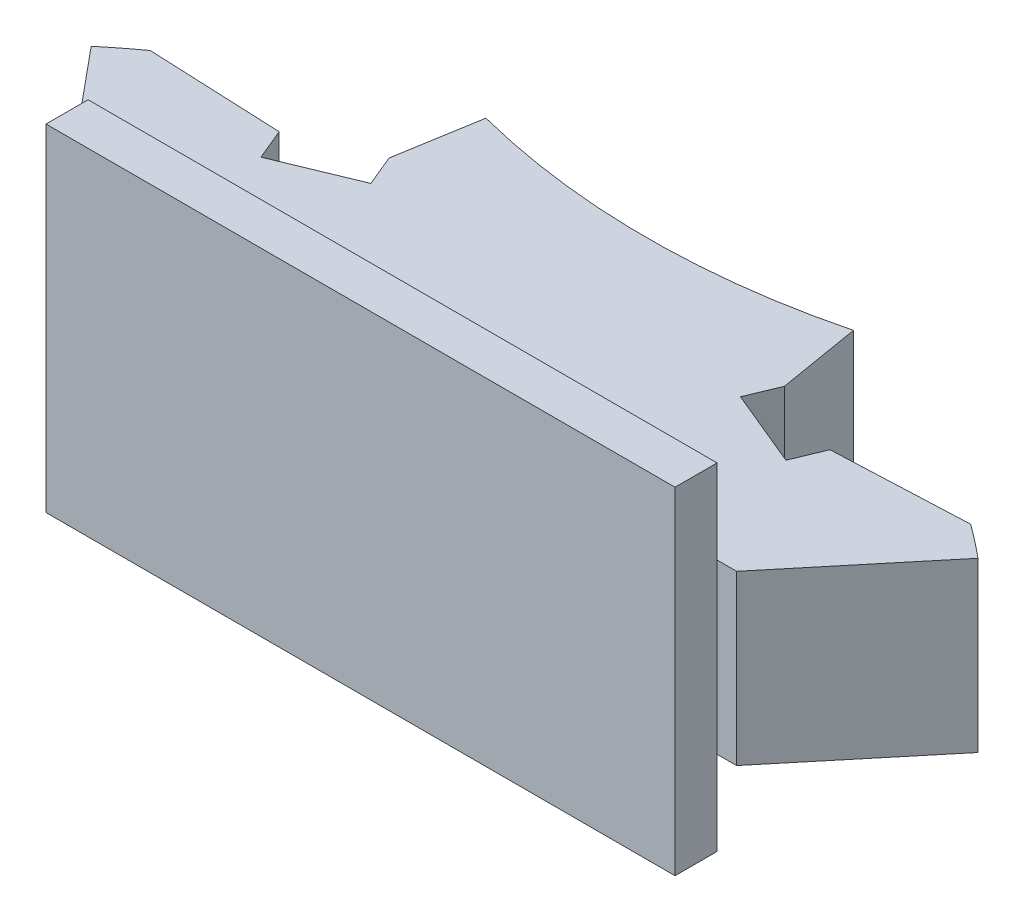
ISO-10303-21;
HEADER;
FILE_DESCRIPTION(('STEP AP214'),'2;1');
FILE_NAME('part.step','',(''),(''),'','','');
FILE_SCHEMA(('AUTOMOTIVE_DESIGN { 1 0 10303 214 1 1 1 1 }'));
ENDSEC;
DATA;
#1=APPLICATION_CONTEXT('core data for automotive mechanical design processes');
#2=APPLICATION_PROTOCOL_DEFINITION('international standard','automotive_design',2000,#1);
#3=PRODUCT_CONTEXT('',#1,'mechanical');
#4=PRODUCT('Part','Part','',(#3));
#5=PRODUCT_RELATED_PRODUCT_CATEGORY('part','',(#4));
#6=PRODUCT_DEFINITION_FORMATION('','',#4);
#7=PRODUCT_DEFINITION_CONTEXT('part definition',#1,'design');
#8=PRODUCT_DEFINITION('design','',#6,#7);
#9=PRODUCT_DEFINITION_SHAPE('','',#8);
#10=(LENGTH_UNIT() NAMED_UNIT(*) SI_UNIT(.MILLI.,.METRE.));
#11=(NAMED_UNIT(*) PLANE_ANGLE_UNIT() SI_UNIT($,.RADIAN.));
#12=(NAMED_UNIT(*) SI_UNIT($,.STERADIAN.) SOLID_ANGLE_UNIT());
#13=UNCERTAINTY_MEASURE_WITH_UNIT(LENGTH_MEASURE(1.E-05),#10,'distance_accuracy_value','');
#14=(GEOMETRIC_REPRESENTATION_CONTEXT(3) GLOBAL_UNCERTAINTY_ASSIGNED_CONTEXT((#13)) GLOBAL_UNIT_ASSIGNED_CONTEXT((#10,
#11,#12)) REPRESENTATION_CONTEXT('',''));
#15=CARTESIAN_POINT('',(0.,0.,0.));
#16=DIRECTION('',(0.,0.,1.));
#17=DIRECTION('',(1.,0.,0.));
#18=AXIS2_PLACEMENT_3D('',#15,#16,#17);
#19=CARTESIAN_POINT('',(-115.533621356237,0.,48.8334296922719));
#20=DIRECTION('',(0.,1.,0.));
#21=DIRECTION('',(0.,0.,1.));
#22=AXIS2_PLACEMENT_3D('',#19,#20,#21);
#23=PLANE('',#22);
#24=DIRECTION('',(1.,0.,0.));
#25=VECTOR('',#24,1.);
#26=CARTESIAN_POINT('',(-115.533621356237,0.,18.415));
#27=LINE('',#26,#25);
#28=CARTESIAN_POINT('',(-25.2117383763098,0.,18.415));
#29=VERTEX_POINT('',#28);
#30=CARTESIAN_POINT('',(-23.7417354028188,0.,18.415));
#31=VERTEX_POINT('',#30);
#32=EDGE_CURVE('E239',#29,#31,#27,.T.);
#33=ORIENTED_EDGE('',*,*,#32,.T.);
#34=DIRECTION('',(1.,0.,0.));
#35=VECTOR('',#34,1.);
#36=CARTESIAN_POINT('',(-115.533621356237,0.,18.415));
#37=LINE('',#36,#35);
#38=CARTESIAN_POINT('',(23.7417354028188,0.,18.415));
#39=VERTEX_POINT('',#38);
#40=EDGE_CURVE('E405',#31,#39,#37,.T.);
#41=ORIENTED_EDGE('',*,*,#40,.T.);
#42=CARTESIAN_POINT('',(25.2117383763098,0.,18.415));
#43=VERTEX_POINT('',#42);
#44=EDGE_CURVE('E230',#39,#43,#27,.T.);
#45=ORIENTED_EDGE('',*,*,#44,.T.);
#46=DIRECTION('',(0.638136368104805,0.,-0.76992335703108));
#47=VECTOR('',#46,1.);
#48=CARTESIAN_POINT('',(-47.0473730286792,0.,105.596957352217));
#49=LINE('',#48,#47);
#50=CARTESIAN_POINT('',(33.4708906434652,0.,8.45017969263472));
#51=VERTEX_POINT('',#50);
#52=EDGE_CURVE('E233',#43,#51,#49,.T.);
#53=ORIENTED_EDGE('',*,*,#52,.T.);
#54=CARTESIAN_POINT('',(0.,0.,48.8334296922719));
#55=DIRECTION('',(0.,1.,0.));
#56=DIRECTION('',(0.,0.,1.));
#57=AXIS2_PLACEMENT_3D('',#54,#55,#56);
#58=CIRCLE('',#57,52.451);
#59=CARTESIAN_POINT('',(30.9661817647511,0.,6.49901121377621));
#60=VERTEX_POINT('',#59);
#61=EDGE_CURVE('E303',#51,#60,#58,.T.);
#62=ORIENTED_EDGE('',*,*,#61,.T.);
#63=DIRECTION('',(0.999048221581858,0.,-0.0436193873653337));
#64=VECTOR('',#63,1.);
#65=CARTESIAN_POINT('',(-117.099727209191,0.,12.9637084121841));
#66=LINE('',#65,#64);
#67=CARTESIAN_POINT('',(20.788013818679,0.,6.94339962338286));
#68=VERTEX_POINT('',#67);
#69=EDGE_CURVE('E300',#68,#60,#66,.T.);
#70=ORIENTED_EDGE('',*,*,#69,.F.);
#71=DIRECTION('',(-0.382683432365092,0.,0.923879532511286));
#72=VECTOR('',#71,1.);
#73=CARTESIAN_POINT('',(-13.9861896043784,0.,90.8957531480484));
#74=LINE('',#73,#72);
#75=CARTESIAN_POINT('',(19.8159979004717,0.,9.29005363596155));
#76=VERTEX_POINT('',#75);
#77=EDGE_CURVE('E296',#68,#76,#74,.T.);
#78=ORIENTED_EDGE('',*,*,#77,.T.);
#79=DIRECTION('',(0.923879532511287,0.,0.382683432365091));
#80=VECTOR('',#79,1.);
#81=CARTESIAN_POINT('',(-81.7314338513875,0.,-32.7722698198149));
#82=LINE('',#81,#80);
#83=CARTESIAN_POINT('',(13.949362869025,0.,6.86001384044323));
#84=VERTEX_POINT('',#83);
#85=EDGE_CURVE('E293',#84,#76,#82,.T.);
#86=ORIENTED_EDGE('',*,*,#85,.F.);
#87=DIRECTION('',(-0.38268343236509,0.,0.923879532511287));
#88=VECTOR('',#87,1.);
#89=CARTESIAN_POINT('',(-19.8528246358249,0.,88.46571335253));
#90=LINE('',#89,#88);
#91=CARTESIAN_POINT('',(14.9213787872323,0.,4.51335982786454));
#92=VERTEX_POINT('',#91);
#93=EDGE_CURVE('E178',#92,#84,#90,.T.);
#94=ORIENTED_EDGE('',*,*,#93,.F.);
#95=DIRECTION('',(-0.165047605860678,0.,-0.986285601537231));
#96=VECTOR('',#95,1.);
#97=CARTESIAN_POINT('',(18.5822933488122,0.,26.3901226061878));
#98=LINE('',#97,#96);
#99=CARTESIAN_POINT('',(13.873326490017,0.,-1.74955374189686));
#100=VERTEX_POINT('',#99);
#101=EDGE_CURVE('E287',#92,#100,#98,.T.);
#102=ORIENTED_EDGE('',*,*,#101,.T.);
#103=CARTESIAN_POINT('',(0.,0.,-55.88));
#104=DIRECTION('',(0.,1.,0.));
#105=DIRECTION('',(0.,0.,1.));
#106=AXIS2_PLACEMENT_3D('',#103,#104,#105);
#107=CIRCLE('',#106,55.88);
#108=CARTESIAN_POINT('',(-13.873326490017,0.,-1.74955374189685));
#109=VERTEX_POINT('',#108);
#110=EDGE_CURVE('E200',#109,#100,#107,.T.);
#111=ORIENTED_EDGE('',*,*,#110,.F.);
#112=DIRECTION('',(0.165047605860678,0.,-0.986285601537231));
#113=VECTOR('',#112,1.);
#114=CARTESIAN_POINT('',(-24.8767296064692,0.,64.00419048889));
#115=LINE('',#114,#113);
#116=CARTESIAN_POINT('',(-14.9213787872323,0.,4.51335982786456));
#117=VERTEX_POINT('',#116);
#118=EDGE_CURVE('E203',#117,#109,#115,.T.);
#119=ORIENTED_EDGE('',*,*,#118,.F.);
#120=DIRECTION('',(0.382683432365091,0.,0.923879532511286));
#121=VECTOR('',#120,1.);
#122=CARTESIAN_POINT('',(-13.9861896043782,0.,6.77110623649548));
#123=LINE('',#122,#121);
#124=CARTESIAN_POINT('',(-13.949362869025,0.,6.86001384044322));
#125=VERTEX_POINT('',#124);
#126=EDGE_CURVE('E207',#117,#125,#123,.T.);
#127=ORIENTED_EDGE('',*,*,#126,.T.);
#128=DIRECTION('',(0.923879532511287,0.,-0.38268343236509));
#129=VECTOR('',#128,1.);
#130=CARTESIAN_POINT('',(-115.496794620884,0.,48.9223372962196));
#131=LINE('',#130,#129);
#132=CARTESIAN_POINT('',(-19.8159979004716,0.,9.29005363596155));
#133=VERTEX_POINT('',#132);
#134=EDGE_CURVE('E211',#133,#125,#131,.T.);
#135=ORIENTED_EDGE('',*,*,#134,.F.);
#136=DIRECTION('',(0.382683432365089,0.,0.923879532511287));
#137=VECTOR('',#136,1.);
#138=CARTESIAN_POINT('',(-19.8528246358248,0.,9.201146032014));
#139=LINE('',#138,#137);
#140=CARTESIAN_POINT('',(-20.788013818679,0.,6.94339962338288));
#141=VERTEX_POINT('',#140);
#142=EDGE_CURVE('E215',#141,#133,#139,.T.);
#143=ORIENTED_EDGE('',*,*,#142,.F.);
#144=DIRECTION('',(-0.999048221581858,0.,-0.0436193873653335));
#145=VECTOR('',#144,1.);
#146=CARTESIAN_POINT('',(-113.527875193469,0.,2.8942898305551));
#147=LINE('',#146,#145);
#148=CARTESIAN_POINT('',(-30.9661817647511,0.,6.49901121377622));
#149=VERTEX_POINT('',#148);
#150=EDGE_CURVE('E218',#141,#149,#147,.T.);
#151=ORIENTED_EDGE('',*,*,#150,.T.);
#152=CARTESIAN_POINT('',(0.,0.,48.8334296922719));
#153=DIRECTION('',(0.,1.,0.));
#154=DIRECTION('',(0.,0.,1.));
#155=AXIS2_PLACEMENT_3D('',#152,#153,#154);
#156=CIRCLE('',#155,52.451);
#157=CARTESIAN_POINT('',(-33.4708906434651,0.,8.4501796926347));
#158=VERTEX_POINT('',#157);
#159=EDGE_CURVE('E222',#149,#158,#156,.T.);
#160=ORIENTED_EDGE('',*,*,#159,.T.);
#161=DIRECTION('',(-0.638136368104805,0.,-0.76992335703108));
#162=VECTOR('',#161,1.);
#163=CARTESIAN_POINT('',(-47.0473730286792,0.,-7.93009796767349));
#164=LINE('',#163,#162);
#165=EDGE_CURVE('E226',#29,#158,#164,.T.);
#166=ORIENTED_EDGE('',*,*,#165,.F.);
#167=EDGE_LOOP('',(#33,#41,#45,#53,#62,#70,#78,#86,#94,#102,#111,#119,#127,#135,#143,#151,#160,#166));
#168=FACE_BOUND('',#167,.T.);
#169=ADVANCED_FACE('F39',(#168),#23,.T.);
#170=CARTESIAN_POINT('',(-115.533621356237,-12.7,18.415));
#171=DIRECTION('',(0.,0.,1.));
#172=DIRECTION('',(1.,0.,0.));
#173=AXIS2_PLACEMENT_3D('',#170,#171,#172);
#174=PLANE('',#173);
#175=DIRECTION('',(1.,0.,0.));
#176=VECTOR('',#175,1.);
#177=CARTESIAN_POINT('',(-115.533621356237,-12.7,18.415));
#178=LINE('',#177,#176);
#179=CARTESIAN_POINT('',(-25.2117383763098,-12.7,18.415));
#180=VERTEX_POINT('',#179);
#181=CARTESIAN_POINT('',(-23.7417354028188,-12.7,18.415));
#182=VERTEX_POINT('',#181);
#183=EDGE_CURVE('E443',#180,#182,#178,.T.);
#184=ORIENTED_EDGE('',*,*,#183,.T.);
#185=DIRECTION('',(0.,1.,0.));
#186=VECTOR('',#185,1.);
#187=CARTESIAN_POINT('',(-23.7417354028188,-19.05,18.415));
#188=LINE('',#187,#186);
#189=EDGE_CURVE('E50',#182,#31,#188,.T.);
#190=ORIENTED_EDGE('',*,*,#189,.T.);
#191=ORIENTED_EDGE('',*,*,#32,.F.);
#192=DIRECTION('',(0.,1.,0.));
#193=VECTOR('',#192,1.);
#194=CARTESIAN_POINT('',(-25.2117383763098,-12.7,18.415));
#195=LINE('',#194,#193);
#196=EDGE_CURVE('E265',#180,#29,#195,.T.);
#197=ORIENTED_EDGE('',*,*,#196,.F.);
#198=EDGE_LOOP('',(#184,#190,#191,#197));
#199=FACE_BOUND('',#198,.T.);
#200=ADVANCED_FACE('F343',(#199),#174,.T.);
#201=CARTESIAN_POINT('',(0.,-12.7,-55.88));
#202=DIRECTION('',(0.,1.,0.));
#203=DIRECTION('',(0.,0.,1.));
#204=AXIS2_PLACEMENT_3D('',#201,#202,#203);
#205=CYLINDRICAL_SURFACE('',#204,55.88);
#206=ORIENTED_EDGE('',*,*,#110,.T.);
#207=DIRECTION('',(0.,1.,0.));
#208=VECTOR('',#207,1.);
#209=CARTESIAN_POINT('',(13.873326490017,-12.7,-1.74955374189686));
#210=LINE('',#209,#208);
#211=CARTESIAN_POINT('',(13.873326490017,-12.7,-1.74955374189686));
#212=VERTEX_POINT('',#211);
#213=EDGE_CURVE('E119',#212,#100,#210,.T.);
#214=ORIENTED_EDGE('',*,*,#213,.F.);
#215=CARTESIAN_POINT('',(0.,-12.7,-55.88));
#216=DIRECTION('',(0.,1.,0.));
#217=DIRECTION('',(0.,0.,1.));
#218=AXIS2_PLACEMENT_3D('',#215,#216,#217);
#219=CIRCLE('',#218,55.88);
#220=CARTESIAN_POINT('',(-13.873326490017,-12.7,-1.74955374189685));
#221=VERTEX_POINT('',#220);
#222=EDGE_CURVE('E59',#221,#212,#219,.T.);
#223=ORIENTED_EDGE('',*,*,#222,.F.);
#224=DIRECTION('',(0.,1.,0.));
#225=VECTOR('',#224,1.);
#226=CARTESIAN_POINT('',(-13.873326490017,-12.7,-1.74955374189685));
#227=LINE('',#226,#225);
#228=EDGE_CURVE('E199',#221,#109,#227,.T.);
#229=ORIENTED_EDGE('',*,*,#228,.T.);
#230=EDGE_LOOP('',(#206,#214,#223,#229));
#231=FACE_BOUND('',#230,.T.);
#232=ADVANCED_FACE('F41',(#231),#205,.F.);
#233=CARTESIAN_POINT('',(18.5822933488122,-12.7,26.3901226061878));
#234=DIRECTION('',(0.986285601537231,0.,-0.165047605860678));
#235=DIRECTION('',(-0.165047605860678,0.,-0.986285601537231));
#236=AXIS2_PLACEMENT_3D('',#233,#234,#235);
#237=PLANE('',#236);
#238=ORIENTED_EDGE('',*,*,#101,.F.);
#239=DIRECTION('',(0.,1.,0.));
#240=VECTOR('',#239,1.);
#241=CARTESIAN_POINT('',(14.9213787872323,-12.7,4.51335982786454));
#242=LINE('',#241,#240);
#243=CARTESIAN_POINT('',(14.9213787872323,-12.7,4.51335982786454));
#244=VERTEX_POINT('',#243);
#245=EDGE_CURVE('E112',#244,#92,#242,.T.);
#246=ORIENTED_EDGE('',*,*,#245,.F.);
#247=DIRECTION('',(-0.165047605860678,0.,-0.986285601537231));
#248=VECTOR('',#247,1.);
#249=CARTESIAN_POINT('',(18.5822933488122,-12.7,26.3901226061878));
#250=LINE('',#249,#248);
#251=EDGE_CURVE('E172',#244,#212,#250,.T.);
#252=ORIENTED_EDGE('',*,*,#251,.T.);
#253=ORIENTED_EDGE('',*,*,#213,.T.);
#254=EDGE_LOOP('',(#238,#246,#252,#253));
#255=FACE_BOUND('',#254,.T.);
#256=ADVANCED_FACE('F335',(#255),#237,.T.);
#257=CARTESIAN_POINT('',(-19.8528246358249,-12.7,88.46571335253));
#258=DIRECTION('',(-0.923879532511287,0.,-0.38268343236509));
#259=DIRECTION('',(-0.38268343236509,0.,0.923879532511287));
#260=AXIS2_PLACEMENT_3D('',#257,#258,#259);
#261=PLANE('',#260);
#262=ORIENTED_EDGE('',*,*,#93,.T.);
#263=DIRECTION('',(0.,1.,0.));
#264=VECTOR('',#263,1.);
#265=CARTESIAN_POINT('',(13.949362869025,-12.7,6.86001384044323));
#266=LINE('',#265,#264);
#267=CARTESIAN_POINT('',(13.949362869025,-12.7,6.86001384044323));
#268=VERTEX_POINT('',#267);
#269=EDGE_CURVE('E176',#268,#84,#266,.T.);
#270=ORIENTED_EDGE('',*,*,#269,.F.);
#271=DIRECTION('',(-0.38268343236509,0.,0.923879532511287));
#272=VECTOR('',#271,1.);
#273=CARTESIAN_POINT('',(-19.8528246358249,-12.7,88.46571335253));
#274=LINE('',#273,#272);
#275=EDGE_CURVE('E165',#244,#268,#274,.T.);
#276=ORIENTED_EDGE('',*,*,#275,.F.);
#277=ORIENTED_EDGE('',*,*,#245,.T.);
#278=EDGE_LOOP('',(#262,#270,#276,#277));
#279=FACE_BOUND('',#278,.T.);
#280=ADVANCED_FACE('F177',(#279),#261,.F.);
#281=CARTESIAN_POINT('',(-81.7314338513875,-12.7,-32.7722698198149));
#282=DIRECTION('',(-0.382683432365091,0.,0.923879532511286));
#283=DIRECTION('',(0.923879532511287,0.,0.382683432365091));
#284=AXIS2_PLACEMENT_3D('',#281,#282,#283);
#285=PLANE('',#284);
#286=ORIENTED_EDGE('',*,*,#85,.T.);
#287=DIRECTION('',(0.,1.,0.));
#288=VECTOR('',#287,1.);
#289=CARTESIAN_POINT('',(19.8159979004717,-12.7,9.29005363596155));
#290=LINE('',#289,#288);
#291=CARTESIAN_POINT('',(19.8159979004717,-12.7,9.29005363596155));
#292=VERTEX_POINT('',#291);
#293=EDGE_CURVE('E183',#292,#76,#290,.T.);
#294=ORIENTED_EDGE('',*,*,#293,.F.);
#295=DIRECTION('',(0.923879532511287,0.,0.382683432365091));
#296=VECTOR('',#295,1.);
#297=CARTESIAN_POINT('',(-81.7314338513875,-12.7,-32.7722698198149));
#298=LINE('',#297,#296);
#299=EDGE_CURVE('E170',#268,#292,#298,.T.);
#300=ORIENTED_EDGE('',*,*,#299,.F.);
#301=ORIENTED_EDGE('',*,*,#269,.T.);
#302=EDGE_LOOP('',(#286,#294,#300,#301));
#303=FACE_BOUND('',#302,.T.);
#304=ADVANCED_FACE('F185',(#303),#285,.F.);
#305=CARTESIAN_POINT('',(-13.9861896043784,-12.7,90.8957531480484));
#306=DIRECTION('',(-0.923879532511286,0.,-0.382683432365092));
#307=DIRECTION('',(-0.382683432365092,0.,0.923879532511286));
#308=AXIS2_PLACEMENT_3D('',#305,#306,#307);
#309=PLANE('',#308);
#310=ORIENTED_EDGE('',*,*,#77,.F.);
#311=DIRECTION('',(0.,1.,0.));
#312=VECTOR('',#311,1.);
#313=CARTESIAN_POINT('',(20.788013818679,-12.7,6.94339962338286));
#314=LINE('',#313,#312);
#315=CARTESIAN_POINT('',(20.788013818679,-12.7,6.94339962338286));
#316=VERTEX_POINT('',#315);
#317=EDGE_CURVE('E278',#316,#68,#314,.T.);
#318=ORIENTED_EDGE('',*,*,#317,.F.);
#319=DIRECTION('',(-0.382683432365092,0.,0.923879532511286));
#320=VECTOR('',#319,1.);
#321=CARTESIAN_POINT('',(-13.9861896043784,-12.7,90.8957531480484));
#322=LINE('',#321,#320);
#323=EDGE_CURVE('E188',#316,#292,#322,.T.);
#324=ORIENTED_EDGE('',*,*,#323,.T.);
#325=ORIENTED_EDGE('',*,*,#293,.T.);
#326=EDGE_LOOP('',(#310,#318,#324,#325));
#327=FACE_BOUND('',#326,.T.);
#328=ADVANCED_FACE('F333',(#327),#309,.T.);
#329=CARTESIAN_POINT('',(-117.099727209191,-12.7,12.9637084121841));
#330=DIRECTION('',(0.0436193873653337,0.,0.999048221581858));
#331=DIRECTION('',(0.999048221581858,0.,-0.0436193873653337));
#332=AXIS2_PLACEMENT_3D('',#329,#330,#331);
#333=PLANE('',#332);
#334=ORIENTED_EDGE('',*,*,#69,.T.);
#335=DIRECTION('',(0.,1.,0.));
#336=VECTOR('',#335,1.);
#337=CARTESIAN_POINT('',(30.9661817647511,-12.7,6.49901121377621));
#338=LINE('',#337,#336);
#339=CARTESIAN_POINT('',(30.9661817647511,-12.7,6.49901121377621));
#340=VERTEX_POINT('',#339);
#341=EDGE_CURVE('E275',#340,#60,#338,.T.);
#342=ORIENTED_EDGE('',*,*,#341,.F.);
#343=DIRECTION('',(0.999048221581858,0.,-0.0436193873653337));
#344=VECTOR('',#343,1.);
#345=CARTESIAN_POINT('',(-117.099727209191,-12.7,12.9637084121841));
#346=LINE('',#345,#344);
#347=EDGE_CURVE('E193',#316,#340,#346,.T.);
#348=ORIENTED_EDGE('',*,*,#347,.F.);
#349=ORIENTED_EDGE('',*,*,#317,.T.);
#350=EDGE_LOOP('',(#334,#342,#348,#349));
#351=FACE_BOUND('',#350,.T.);
#352=ADVANCED_FACE('F330',(#351),#333,.F.);
#353=CARTESIAN_POINT('',(0.,-12.7,48.8334296922719));
#354=DIRECTION('',(0.,1.,0.));
#355=DIRECTION('',(0.,0.,1.));
#356=AXIS2_PLACEMENT_3D('',#353,#354,#355);
#357=CYLINDRICAL_SURFACE('',#356,52.451);
#358=ORIENTED_EDGE('',*,*,#61,.F.);
#359=DIRECTION('',(0.,1.,0.));
#360=VECTOR('',#359,1.);
#361=CARTESIAN_POINT('',(33.4708906434652,-12.7,8.45017969263472));
#362=LINE('',#361,#360);
#363=CARTESIAN_POINT('',(33.4708906434652,-12.7,8.45017969263472));
#364=VERTEX_POINT('',#363);
#365=EDGE_CURVE('E272',#364,#51,#362,.T.);
#366=ORIENTED_EDGE('',*,*,#365,.F.);
#367=CARTESIAN_POINT('',(0.,-12.7,48.8334296922719));
#368=DIRECTION('',(0.,1.,0.));
#369=DIRECTION('',(0.,0.,1.));
#370=AXIS2_PLACEMENT_3D('',#367,#368,#369);
#371=CIRCLE('',#370,52.451);
#372=EDGE_CURVE('E327',#364,#340,#371,.T.);
#373=ORIENTED_EDGE('',*,*,#372,.T.);
#374=ORIENTED_EDGE('',*,*,#341,.T.);
#375=EDGE_LOOP('',(#358,#366,#373,#374));
#376=FACE_BOUND('',#375,.T.);
#377=ADVANCED_FACE('F325',(#376),#357,.T.);
#378=CARTESIAN_POINT('',(-47.0473730286792,-12.7,105.596957352217));
#379=DIRECTION('',(0.76992335703108,0.,0.638136368104805));
#380=DIRECTION('',(0.638136368104805,0.,-0.76992335703108));
#381=AXIS2_PLACEMENT_3D('',#378,#379,#380);
#382=PLANE('',#381);
#383=ORIENTED_EDGE('',*,*,#52,.F.);
#384=DIRECTION('',(0.,1.,0.));
#385=VECTOR('',#384,1.);
#386=CARTESIAN_POINT('',(25.2117383763098,-12.7,18.415));
#387=LINE('',#386,#385);
#388=CARTESIAN_POINT('',(25.2117383763098,-12.7,18.415));
#389=VERTEX_POINT('',#388);
#390=EDGE_CURVE('E268',#389,#43,#387,.T.);
#391=ORIENTED_EDGE('',*,*,#390,.F.);
#392=DIRECTION('',(0.638136368104805,0.,-0.76992335703108));
#393=VECTOR('',#392,1.);
#394=CARTESIAN_POINT('',(-47.0473730286792,-12.7,105.596957352217));
#395=LINE('',#394,#393);
#396=EDGE_CURVE('E321',#389,#364,#395,.T.);
#397=ORIENTED_EDGE('',*,*,#396,.T.);
#398=ORIENTED_EDGE('',*,*,#365,.T.);
#399=EDGE_LOOP('',(#383,#391,#397,#398));
#400=FACE_BOUND('',#399,.T.);
#401=ADVANCED_FACE('F318',(#400),#382,.T.);
#402=DIRECTION('',(0.,1.,0.));
#403=VECTOR('',#402,1.);
#404=CARTESIAN_POINT('',(23.7417354028188,-19.05,18.415));
#405=LINE('',#404,#403);
#406=CARTESIAN_POINT('',(23.7417354028188,-12.7,18.415));
#407=VERTEX_POINT('',#406);
#408=EDGE_CURVE('E11',#407,#39,#405,.T.);
#409=ORIENTED_EDGE('',*,*,#408,.F.);
#410=EDGE_CURVE('E455',#407,#389,#178,.T.);
#411=ORIENTED_EDGE('',*,*,#410,.T.);
#412=ORIENTED_EDGE('',*,*,#390,.T.);
#413=ORIENTED_EDGE('',*,*,#44,.F.);
#414=EDGE_LOOP('',(#409,#411,#412,#413));
#415=FACE_BOUND('',#414,.T.);
#416=ADVANCED_FACE('F352',(#415),#174,.T.);
#417=CARTESIAN_POINT('',(-47.0473730286792,-12.7,-7.93009796767349));
#418=DIRECTION('',(0.76992335703108,0.,-0.638136368104805));
#419=DIRECTION('',(-0.638136368104805,0.,-0.76992335703108));
#420=AXIS2_PLACEMENT_3D('',#417,#418,#419);
#421=PLANE('',#420);
#422=ORIENTED_EDGE('',*,*,#165,.T.);
#423=DIRECTION('',(0.,1.,0.));
#424=VECTOR('',#423,1.);
#425=CARTESIAN_POINT('',(-33.4708906434651,-12.7,8.4501796926347));
#426=LINE('',#425,#424);
#427=CARTESIAN_POINT('',(-33.4708906434651,-12.7,8.4501796926347));
#428=VERTEX_POINT('',#427);
#429=EDGE_CURVE('E262',#428,#158,#426,.T.);
#430=ORIENTED_EDGE('',*,*,#429,.F.);
#431=DIRECTION('',(-0.638136368104805,0.,-0.76992335703108));
#432=VECTOR('',#431,1.);
#433=CARTESIAN_POINT('',(-47.0473730286792,-12.7,-7.93009796767349));
#434=LINE('',#433,#432);
#435=EDGE_CURVE('E452',#180,#428,#434,.T.);
#436=ORIENTED_EDGE('',*,*,#435,.F.);
#437=ORIENTED_EDGE('',*,*,#196,.T.);
#438=EDGE_LOOP('',(#422,#430,#436,#437));
#439=FACE_BOUND('',#438,.T.);
#440=ADVANCED_FACE('F449',(#439),#421,.F.);
#441=CARTESIAN_POINT('',(0.,-12.7,48.8334296922719));
#442=DIRECTION('',(0.,1.,0.));
#443=DIRECTION('',(0.,0.,1.));
#444=AXIS2_PLACEMENT_3D('',#441,#442,#443);
#445=CYLINDRICAL_SURFACE('',#444,52.451);
#446=ORIENTED_EDGE('',*,*,#159,.F.);
#447=DIRECTION('',(0.,1.,0.));
#448=VECTOR('',#447,1.);
#449=CARTESIAN_POINT('',(-30.9661817647511,-12.7,6.49901121377622));
#450=LINE('',#449,#448);
#451=CARTESIAN_POINT('',(-30.9661817647511,-12.7,6.49901121377622));
#452=VERTEX_POINT('',#451);
#453=EDGE_CURVE('E259',#452,#149,#450,.T.);
#454=ORIENTED_EDGE('',*,*,#453,.F.);
#455=CARTESIAN_POINT('',(0.,-12.7,48.8334296922719));
#456=DIRECTION('',(0.,1.,0.));
#457=DIRECTION('',(0.,0.,1.));
#458=AXIS2_PLACEMENT_3D('',#455,#456,#457);
#459=CIRCLE('',#458,52.451);
#460=EDGE_CURVE('E456',#452,#428,#459,.T.);
#461=ORIENTED_EDGE('',*,*,#460,.T.);
#462=ORIENTED_EDGE('',*,*,#429,.T.);
#463=EDGE_LOOP('',(#446,#454,#461,#462));
#464=FACE_BOUND('',#463,.T.);
#465=ADVANCED_FACE('F522',(#464),#445,.T.);
#466=CARTESIAN_POINT('',(-113.527875193469,-12.7,2.8942898305551));
#467=DIRECTION('',(0.0436193873653335,0.,-0.999048221581858));
#468=DIRECTION('',(-0.999048221581858,0.,-0.0436193873653335));
#469=AXIS2_PLACEMENT_3D('',#466,#467,#468);
#470=PLANE('',#469);
#471=ORIENTED_EDGE('',*,*,#150,.F.);
#472=DIRECTION('',(0.,1.,0.));
#473=VECTOR('',#472,1.);
#474=CARTESIAN_POINT('',(-20.788013818679,-12.7,6.94339962338288));
#475=LINE('',#474,#473);
#476=CARTESIAN_POINT('',(-20.788013818679,-12.7,6.94339962338288));
#477=VERTEX_POINT('',#476);
#478=EDGE_CURVE('E256',#477,#141,#475,.T.);
#479=ORIENTED_EDGE('',*,*,#478,.F.);
#480=DIRECTION('',(-0.999048221581858,0.,-0.0436193873653335));
#481=VECTOR('',#480,1.);
#482=CARTESIAN_POINT('',(-113.527875193469,-12.7,2.8942898305551));
#483=LINE('',#482,#481);
#484=EDGE_CURVE('E516',#477,#452,#483,.T.);
#485=ORIENTED_EDGE('',*,*,#484,.T.);
#486=ORIENTED_EDGE('',*,*,#453,.T.);
#487=EDGE_LOOP('',(#471,#479,#485,#486));
#488=FACE_BOUND('',#487,.T.);
#489=ADVANCED_FACE('F526',(#488),#470,.T.);
#490=CARTESIAN_POINT('',(-19.8528246358248,-12.7,9.201146032014));
#491=DIRECTION('',(-0.923879532511287,0.,0.382683432365089));
#492=DIRECTION('',(0.382683432365089,0.,0.923879532511287));
#493=AXIS2_PLACEMENT_3D('',#490,#491,#492);
#494=PLANE('',#493);
#495=ORIENTED_EDGE('',*,*,#142,.T.);
#496=DIRECTION('',(0.,1.,0.));
#497=VECTOR('',#496,1.);
#498=CARTESIAN_POINT('',(-19.8159979004716,-12.7,9.29005363596155));
#499=LINE('',#498,#497);
#500=CARTESIAN_POINT('',(-19.8159979004716,-12.7,9.29005363596155));
#501=VERTEX_POINT('',#500);
#502=EDGE_CURVE('E252',#501,#133,#499,.T.);
#503=ORIENTED_EDGE('',*,*,#502,.F.);
#504=DIRECTION('',(0.382683432365089,0.,0.923879532511287));
#505=VECTOR('',#504,1.);
#506=CARTESIAN_POINT('',(-19.8528246358248,-12.7,9.201146032014));
#507=LINE('',#506,#505);
#508=EDGE_CURVE('E514',#477,#501,#507,.T.);
#509=ORIENTED_EDGE('',*,*,#508,.F.);
#510=ORIENTED_EDGE('',*,*,#478,.T.);
#511=EDGE_LOOP('',(#495,#503,#509,#510));
#512=FACE_BOUND('',#511,.T.);
#513=ADVANCED_FACE('F531',(#512),#494,.F.);
#514=CARTESIAN_POINT('',(-115.496794620884,-12.7,48.9223372962196));
#515=DIRECTION('',(0.38268343236509,0.,0.923879532511287));
#516=DIRECTION('',(0.923879532511287,0.,-0.38268343236509));
#517=AXIS2_PLACEMENT_3D('',#514,#515,#516);
#518=PLANE('',#517);
#519=ORIENTED_EDGE('',*,*,#134,.T.);
#520=DIRECTION('',(0.,1.,0.));
#521=VECTOR('',#520,1.);
#522=CARTESIAN_POINT('',(-13.949362869025,-12.7,6.86001384044322));
#523=LINE('',#522,#521);
#524=CARTESIAN_POINT('',(-13.949362869025,-12.7,6.86001384044322));
#525=VERTEX_POINT('',#524);
#526=EDGE_CURVE('E249',#525,#125,#523,.T.);
#527=ORIENTED_EDGE('',*,*,#526,.F.);
#528=DIRECTION('',(0.923879532511287,0.,-0.38268343236509));
#529=VECTOR('',#528,1.);
#530=CARTESIAN_POINT('',(-115.496794620884,-12.7,48.9223372962196));
#531=LINE('',#530,#529);
#532=EDGE_CURVE('E511',#501,#525,#531,.T.);
#533=ORIENTED_EDGE('',*,*,#532,.F.);
#534=ORIENTED_EDGE('',*,*,#502,.T.);
#535=EDGE_LOOP('',(#519,#527,#533,#534));
#536=FACE_BOUND('',#535,.T.);
#537=ADVANCED_FACE('F535',(#536),#518,.F.);
#538=CARTESIAN_POINT('',(-13.9861896043782,-12.7,6.77110623649548));
#539=DIRECTION('',(-0.923879532511286,0.,0.382683432365091));
#540=DIRECTION('',(0.382683432365091,0.,0.923879532511286));
#541=AXIS2_PLACEMENT_3D('',#538,#539,#540);
#542=PLANE('',#541);
#543=ORIENTED_EDGE('',*,*,#126,.F.);
#544=DIRECTION('',(0.,1.,0.));
#545=VECTOR('',#544,1.);
#546=CARTESIAN_POINT('',(-14.9213787872323,-12.7,4.51335982786456));
#547=LINE('',#546,#545);
#548=CARTESIAN_POINT('',(-14.9213787872323,-12.7,4.51335982786456));
#549=VERTEX_POINT('',#548);
#550=EDGE_CURVE('E246',#549,#117,#547,.T.);
#551=ORIENTED_EDGE('',*,*,#550,.F.);
#552=DIRECTION('',(0.382683432365091,0.,0.923879532511286));
#553=VECTOR('',#552,1.);
#554=CARTESIAN_POINT('',(-13.9861896043782,-12.7,6.77110623649548));
#555=LINE('',#554,#553);
#556=EDGE_CURVE('E508',#549,#525,#555,.T.);
#557=ORIENTED_EDGE('',*,*,#556,.T.);
#558=ORIENTED_EDGE('',*,*,#526,.T.);
#559=EDGE_LOOP('',(#543,#551,#557,#558));
#560=FACE_BOUND('',#559,.T.);
#561=ADVANCED_FACE('F539',(#560),#542,.T.);
#562=CARTESIAN_POINT('',(-24.8767296064692,-12.7,64.00419048889));
#563=DIRECTION('',(0.986285601537231,0.,0.165047605860678));
#564=DIRECTION('',(0.165047605860678,0.,-0.986285601537231));
#565=AXIS2_PLACEMENT_3D('',#562,#563,#564);
#566=PLANE('',#565);
#567=ORIENTED_EDGE('',*,*,#118,.T.);
#568=ORIENTED_EDGE('',*,*,#228,.F.);
#569=DIRECTION('',(0.165047605860678,0.,-0.986285601537231));
#570=VECTOR('',#569,1.);
#571=CARTESIAN_POINT('',(-24.8767296064692,-12.7,64.00419048889));
#572=LINE('',#571,#570);
#573=EDGE_CURVE('E125',#549,#221,#572,.T.);
#574=ORIENTED_EDGE('',*,*,#573,.F.);
#575=ORIENTED_EDGE('',*,*,#550,.T.);
#576=EDGE_LOOP('',(#567,#568,#574,#575));
#577=FACE_BOUND('',#576,.T.);
#578=ADVANCED_FACE('F357',(#577),#566,.F.);
#579=CARTESIAN_POINT('',(-115.533621356237,-12.7,48.8334296922719));
#580=DIRECTION('',(0.,1.,0.));
#581=DIRECTION('',(0.,0.,1.));
#582=AXIS2_PLACEMENT_3D('',#579,#580,#581);
#583=PLANE('',#582);
#584=ORIENTED_EDGE('',*,*,#222,.T.);
#585=ORIENTED_EDGE('',*,*,#251,.F.);
#586=ORIENTED_EDGE('',*,*,#275,.T.);
#587=ORIENTED_EDGE('',*,*,#299,.T.);
#588=ORIENTED_EDGE('',*,*,#323,.F.);
#589=ORIENTED_EDGE('',*,*,#347,.T.);
#590=ORIENTED_EDGE('',*,*,#372,.F.);
#591=ORIENTED_EDGE('',*,*,#396,.F.);
#592=ORIENTED_EDGE('',*,*,#410,.F.);
#593=EDGE_CURVE('E461',#182,#407,#178,.T.);
#594=ORIENTED_EDGE('',*,*,#593,.F.);
#595=ORIENTED_EDGE('',*,*,#183,.F.);
#596=ORIENTED_EDGE('',*,*,#435,.T.);
#597=ORIENTED_EDGE('',*,*,#460,.F.);
#598=ORIENTED_EDGE('',*,*,#484,.F.);
#599=ORIENTED_EDGE('',*,*,#508,.T.);
#600=ORIENTED_EDGE('',*,*,#532,.T.);
#601=ORIENTED_EDGE('',*,*,#556,.F.);
#602=ORIENTED_EDGE('',*,*,#573,.T.);
#603=EDGE_LOOP('',(#584,#585,#586,#587,#588,#589,#590,#591,#592,#594,#595,#596,#597,#598,#599,
#600,#601,#602));
#604=FACE_BOUND('',#603,.T.);
#605=ADVANCED_FACE('F167',(#604),#583,.F.);
#606=CARTESIAN_POINT('',(-115.533621356237,-19.05,18.415));
#607=DIRECTION('',(0.,0.,1.));
#608=DIRECTION('',(1.,0.,0.));
#609=AXIS2_PLACEMENT_3D('',#606,#607,#608);
#610=PLANE('',#609);
#611=CARTESIAN_POINT('',(-23.7417354028188,-19.05,18.415));
#612=VERTEX_POINT('',#611);
#613=EDGE_CURVE('E204',#612,#182,#188,.T.);
#614=ORIENTED_EDGE('',*,*,#613,.T.);
#615=ORIENTED_EDGE('',*,*,#593,.T.);
#616=CARTESIAN_POINT('',(23.7417354028188,-19.05,18.415));
#617=VERTEX_POINT('',#616);
#618=EDGE_CURVE('E495',#617,#407,#405,.T.);
#619=ORIENTED_EDGE('',*,*,#618,.F.);
#620=DIRECTION('',(1.,0.,0.));
#621=VECTOR('',#620,1.);
#622=CARTESIAN_POINT('',(-115.533621356237,-19.05,18.415));
#623=LINE('',#622,#621);
#624=EDGE_CURVE('E499',#612,#617,#623,.T.);
#625=ORIENTED_EDGE('',*,*,#624,.F.);
#626=EDGE_LOOP('',(#614,#615,#619,#625));
#627=FACE_BOUND('',#626,.T.);
#628=ADVANCED_FACE('F356',(#627),#610,.F.);
#629=CARTESIAN_POINT('',(-23.7417354028188,-19.05,48.8334296922719));
#630=DIRECTION('',(-1.,0.,0.));
#631=DIRECTION('',(0.,0.,1.));
#632=AXIS2_PLACEMENT_3D('',#629,#630,#631);
#633=PLANE('',#632);
#634=DIRECTION('',(0.,1.,0.));
#635=VECTOR('',#634,1.);
#636=CARTESIAN_POINT('',(-23.7417354028188,-19.05,21.59));
#637=LINE('',#636,#635);
#638=CARTESIAN_POINT('',(-23.7417354028188,-19.05,21.59));
#639=VERTEX_POINT('',#638);
#640=CARTESIAN_POINT('',(-23.7417354028188,6.35,21.59));
#641=VERTEX_POINT('',#640);
#642=EDGE_CURVE('E496',#639,#641,#637,.T.);
#643=ORIENTED_EDGE('',*,*,#642,.T.);
#644=DIRECTION('',(0.,0.,1.));
#645=VECTOR('',#644,1.);
#646=CARTESIAN_POINT('',(-23.7417354028188,6.35,48.8334296922719));
#647=LINE('',#646,#645);
#648=CARTESIAN_POINT('',(-23.7417354028188,6.35,18.415));
#649=VERTEX_POINT('',#648);
#650=EDGE_CURVE('E391',#649,#641,#647,.T.);
#651=ORIENTED_EDGE('',*,*,#650,.F.);
#652=DIRECTION('',(0.,-1.,0.));
#653=VECTOR('',#652,1.);
#654=CARTESIAN_POINT('',(-23.7417354028188,6.35,18.415));
#655=LINE('',#654,#653);
#656=EDGE_CURVE('E417',#649,#31,#655,.T.);
#657=ORIENTED_EDGE('',*,*,#656,.T.);
#658=ORIENTED_EDGE('',*,*,#189,.F.);
#659=ORIENTED_EDGE('',*,*,#613,.F.);
#660=DIRECTION('',(0.,0.,1.));
#661=VECTOR('',#660,1.);
#662=CARTESIAN_POINT('',(-23.7417354028188,-19.05,48.8334296922719));
#663=LINE('',#662,#661);
#664=EDGE_CURVE('E420',#612,#639,#663,.T.);
#665=ORIENTED_EDGE('',*,*,#664,.T.);
#666=EDGE_LOOP('',(#643,#651,#657,#658,#659,#665));
#667=FACE_BOUND('',#666,.T.);
#668=ADVANCED_FACE('F358',(#667),#633,.T.);
#669=CARTESIAN_POINT('',(23.7417354028188,-19.05,48.8334296922719));
#670=DIRECTION('',(-1.,0.,0.));
#671=DIRECTION('',(0.,0.,1.));
#672=AXIS2_PLACEMENT_3D('',#669,#670,#671);
#673=PLANE('',#672);
#674=ORIENTED_EDGE('',*,*,#408,.T.);
#675=DIRECTION('',(0.,-1.,0.));
#676=VECTOR('',#675,1.);
#677=CARTESIAN_POINT('',(23.7417354028188,6.35,18.415));
#678=LINE('',#677,#676);
#679=CARTESIAN_POINT('',(23.7417354028188,6.35,18.415));
#680=VERTEX_POINT('',#679);
#681=EDGE_CURVE('E424',#680,#39,#678,.T.);
#682=ORIENTED_EDGE('',*,*,#681,.F.);
#683=DIRECTION('',(0.,0.,1.));
#684=VECTOR('',#683,1.);
#685=CARTESIAN_POINT('',(23.7417354028188,6.35,48.8334296922719));
#686=LINE('',#685,#684);
#687=CARTESIAN_POINT('',(23.7417354028188,6.35,21.59));
#688=VERTEX_POINT('',#687);
#689=EDGE_CURVE('E409',#680,#688,#686,.T.);
#690=ORIENTED_EDGE('',*,*,#689,.T.);
#691=DIRECTION('',(0.,1.,0.));
#692=VECTOR('',#691,1.);
#693=CARTESIAN_POINT('',(23.7417354028188,-19.05,21.59));
#694=LINE('',#693,#692);
#695=CARTESIAN_POINT('',(23.7417354028188,-19.05,21.59));
#696=VERTEX_POINT('',#695);
#697=EDGE_CURVE('E490',#696,#688,#694,.T.);
#698=ORIENTED_EDGE('',*,*,#697,.F.);
#699=DIRECTION('',(0.,0.,1.));
#700=VECTOR('',#699,1.);
#701=CARTESIAN_POINT('',(23.7417354028188,-19.05,48.8334296922719));
#702=LINE('',#701,#700);
#703=EDGE_CURVE('E821',#617,#696,#702,.T.);
#704=ORIENTED_EDGE('',*,*,#703,.F.);
#705=ORIENTED_EDGE('',*,*,#618,.T.);
#706=EDGE_LOOP('',(#674,#682,#690,#698,#704,#705));
#707=FACE_BOUND('',#706,.T.);
#708=ADVANCED_FACE('F361',(#707),#673,.F.);
#709=CARTESIAN_POINT('',(-115.533621356237,-19.05,21.59));
#710=DIRECTION('',(0.,0.,1.));
#711=DIRECTION('',(1.,0.,0.));
#712=AXIS2_PLACEMENT_3D('',#709,#710,#711);
#713=PLANE('',#712);
#714=ORIENTED_EDGE('',*,*,#697,.T.);
#715=DIRECTION('',(1.,0.,0.));
#716=VECTOR('',#715,1.);
#717=CARTESIAN_POINT('',(-115.533621356237,6.35,21.59));
#718=LINE('',#717,#716);
#719=EDGE_CURVE('E395',#641,#688,#718,.T.);
#720=ORIENTED_EDGE('',*,*,#719,.F.);
#721=ORIENTED_EDGE('',*,*,#642,.F.);
#722=DIRECTION('',(1.,0.,0.));
#723=VECTOR('',#722,1.);
#724=CARTESIAN_POINT('',(-115.533621356237,-19.05,21.59));
#725=LINE('',#724,#723);
#726=EDGE_CURVE('E492',#639,#696,#725,.T.);
#727=ORIENTED_EDGE('',*,*,#726,.T.);
#728=EDGE_LOOP('',(#714,#720,#721,#727));
#729=FACE_BOUND('',#728,.T.);
#730=ADVANCED_FACE('F363',(#729),#713,.T.);
#731=CARTESIAN_POINT('',(-115.533621356237,-19.05,48.8334296922719));
#732=DIRECTION('',(0.,1.,0.));
#733=DIRECTION('',(0.,0.,1.));
#734=AXIS2_PLACEMENT_3D('',#731,#732,#733);
#735=PLANE('',#734);
#736=ORIENTED_EDGE('',*,*,#664,.F.);
#737=ORIENTED_EDGE('',*,*,#624,.T.);
#738=ORIENTED_EDGE('',*,*,#703,.T.);
#739=ORIENTED_EDGE('',*,*,#726,.F.);
#740=EDGE_LOOP('',(#736,#737,#738,#739));
#741=FACE_BOUND('',#740,.T.);
#742=ADVANCED_FACE('F366',(#741),#735,.F.);
#743=CARTESIAN_POINT('',(-115.533621356237,6.35,18.415));
#744=DIRECTION('',(0.,0.,-1.));
#745=DIRECTION('',(-1.,0.,0.));
#746=AXIS2_PLACEMENT_3D('',#743,#744,#745);
#747=PLANE('',#746);
#748=ORIENTED_EDGE('',*,*,#40,.F.);
#749=ORIENTED_EDGE('',*,*,#656,.F.);
#750=DIRECTION('',(1.,0.,0.));
#751=VECTOR('',#750,1.);
#752=CARTESIAN_POINT('',(-115.533621356237,6.35,18.415));
#753=LINE('',#752,#751);
#754=EDGE_CURVE('E399',#649,#680,#753,.T.);
#755=ORIENTED_EDGE('',*,*,#754,.T.);
#756=ORIENTED_EDGE('',*,*,#681,.T.);
#757=EDGE_LOOP('',(#748,#749,#755,#756));
#758=FACE_BOUND('',#757,.T.);
#759=ADVANCED_FACE('F376',(#758),#747,.T.);
#760=CARTESIAN_POINT('',(-115.533621356237,6.35,48.8334296922719));
#761=DIRECTION('',(0.,1.,0.));
#762=DIRECTION('',(0.,0.,1.));
#763=AXIS2_PLACEMENT_3D('',#760,#761,#762);
#764=PLANE('',#763);
#765=ORIENTED_EDGE('',*,*,#650,.T.);
#766=ORIENTED_EDGE('',*,*,#719,.T.);
#767=ORIENTED_EDGE('',*,*,#689,.F.);
#768=ORIENTED_EDGE('',*,*,#754,.F.);
#769=EDGE_LOOP('',(#765,#766,#767,#768));
#770=FACE_BOUND('',#769,.T.);
#771=ADVANCED_FACE('F380',(#770),#764,.T.);
#772=CLOSED_SHELL('',(#169,#200,#232,#256,#280,#304,#328,#352,#377,#401,#416,#440,#465,#489,
#513,#537,#561,#578,#605,#628,#668,#708,#730,#742,#759,#771));
#773=MANIFOLD_SOLID_BREP('B2',#772);
#774=ADVANCED_BREP_SHAPE_REPRESENTATION('',(#18,#773),#14);
#775=SHAPE_DEFINITION_REPRESENTATION(#9,#774);
ENDSEC;
END-ISO-10303-21;
